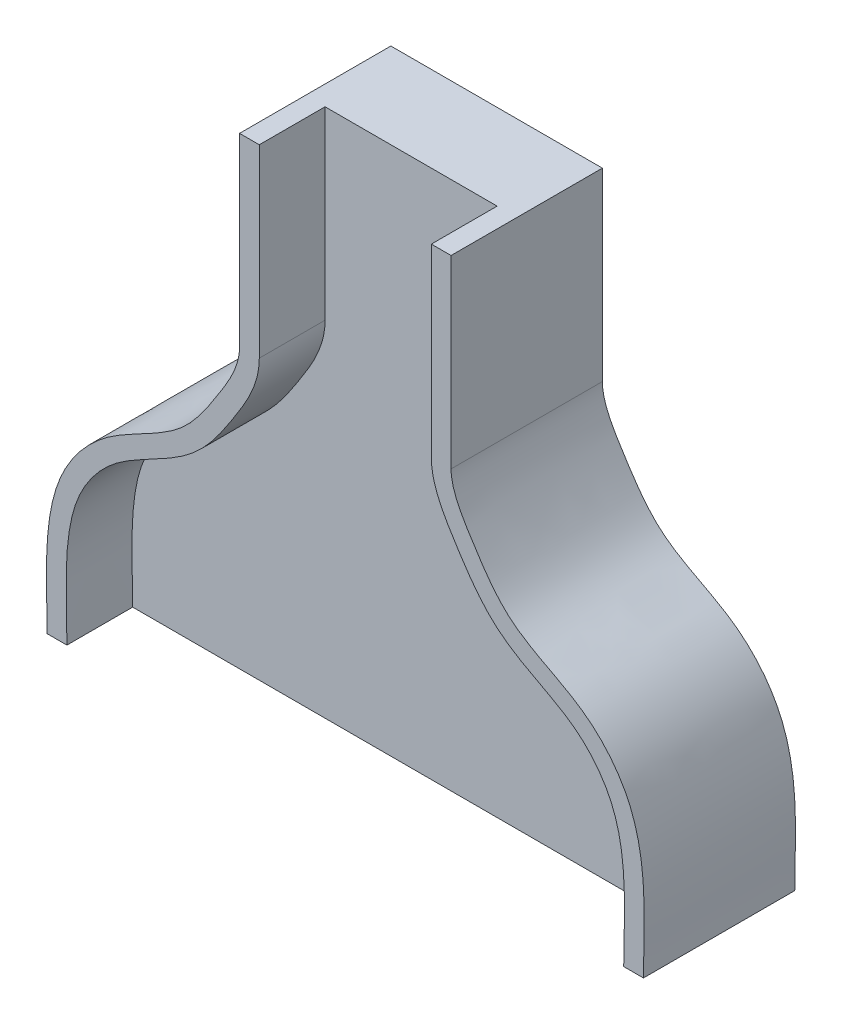
ISO-10303-21;
HEADER;
FILE_DESCRIPTION(('STEP AP214'),'2;1');
FILE_NAME('part.step','',(''),(''),'','','');
FILE_SCHEMA(('AUTOMOTIVE_DESIGN { 1 0 10303 214 1 1 1 1 }'));
ENDSEC;
DATA;
#1=APPLICATION_CONTEXT('core data for automotive mechanical design processes');
#2=APPLICATION_PROTOCOL_DEFINITION('international standard','automotive_design',2000,#1);
#3=PRODUCT_CONTEXT('',#1,'mechanical');
#4=PRODUCT('Part','Part','',(#3));
#5=PRODUCT_RELATED_PRODUCT_CATEGORY('part','',(#4));
#6=PRODUCT_DEFINITION_FORMATION('','',#4);
#7=PRODUCT_DEFINITION_CONTEXT('part definition',#1,'design');
#8=PRODUCT_DEFINITION('design','',#6,#7);
#9=PRODUCT_DEFINITION_SHAPE('','',#8);
#10=(LENGTH_UNIT() NAMED_UNIT(*) SI_UNIT(.MILLI.,.METRE.));
#11=(NAMED_UNIT(*) PLANE_ANGLE_UNIT() SI_UNIT($,.RADIAN.));
#12=(NAMED_UNIT(*) SI_UNIT($,.STERADIAN.) SOLID_ANGLE_UNIT());
#13=UNCERTAINTY_MEASURE_WITH_UNIT(LENGTH_MEASURE(1.E-05),#10,'distance_accuracy_value','');
#14=(GEOMETRIC_REPRESENTATION_CONTEXT(3) GLOBAL_UNCERTAINTY_ASSIGNED_CONTEXT((#13)) GLOBAL_UNIT_ASSIGNED_CONTEXT((#10,
#11,#12)) REPRESENTATION_CONTEXT('',''));
#15=CARTESIAN_POINT('',(0.,0.,0.));
#16=DIRECTION('',(0.,0.,1.));
#17=DIRECTION('',(1.,0.,0.));
#18=AXIS2_PLACEMENT_3D('',#15,#16,#17);
#19=CARTESIAN_POINT('',(11.3560564434234,41.916469453786,13.));
#20=DIRECTION('',(0.,0.,-1.));
#21=DIRECTION('',(-1.,0.,0.));
#22=AXIS2_PLACEMENT_3D('',#19,#20,#21);
#23=PLANE('',#22);
#24=CARTESIAN_POINT('',(90.7885163839061,12.2043310052196,13.));
#25=CARTESIAN_POINT('',(90.7907385917334,13.5108086506275,13.));
#26=CARTESIAN_POINT('',(90.8204245142585,14.831885643645,13.));
#27=CARTESIAN_POINT('',(90.8771412079609,17.4800295011893,13.));
#28=CARTESIAN_POINT('',(90.9042296775414,18.8070199288483,13.));
#29=CARTESIAN_POINT('',(90.9030050098147,22.7520053944305,13.));
#30=CARTESIAN_POINT('',(90.788620296591,25.3334691189714,13.));
#31=CARTESIAN_POINT('',(90.1826831121027,28.9299196411498,13.));
#32=CARTESIAN_POINT('',(89.9093545349235,30.0824944682274,13.));
#33=CARTESIAN_POINT('',(89.3665723681147,31.7251527920537,13.));
#34=CARTESIAN_POINT('',(89.163553765839,32.2584697870363,13.));
#35=CARTESIAN_POINT('',(88.7087210852857,33.2958353739081,13.));
#36=CARTESIAN_POINT('',(88.4546918523771,33.8041319641894,13.));
#37=CARTESIAN_POINT('',(87.0508202706975,36.2993070416371,13.));
#38=CARTESIAN_POINT('',(85.5062885483655,38.1234154188238,13.));
#39=CARTESIAN_POINT('',(83.247671587357,39.9470605741203,13.));
#40=CARTESIAN_POINT('',(82.7823128322237,40.2860911520853,13.));
#41=CARTESIAN_POINT('',(81.7894786593612,40.9473116263716,13.));
#42=CARTESIAN_POINT('',(81.266128474671,41.2673237394009,13.));
#43=CARTESIAN_POINT('',(79.6311234466667,42.213099327925,13.));
#44=CARTESIAN_POINT('',(78.4544330046763,42.8229465040545,13.));
#45=CARTESIAN_POINT('',(76.0304394313467,44.1268459438375,13.));
#46=CARTESIAN_POINT('',(74.7822545553732,44.8209092024868,13.));
#47=CARTESIAN_POINT('',(72.9447803945051,46.057426343286,13.));
#48=CARTESIAN_POINT('',(72.3382837330114,46.5026526237825,13.));
#49=CARTESIAN_POINT('',(71.4536306371995,47.2384524500872,13.));
#50=CARTESIAN_POINT('',(71.164266124772,47.4946310319936,13.));
#51=CARTESIAN_POINT('',(70.6082661553949,48.0163727924184,13.));
#52=CARTESIAN_POINT('',(70.3397852307367,48.2832777024401,13.));
#53=CARTESIAN_POINT('',(69.040196623681,49.6421285340913,13.));
#54=CARTESIAN_POINT('',(68.1376231701748,50.8047479777917,13.));
#55=CARTESIAN_POINT('',(66.8874129981532,52.5808069181246,13.));
#56=CARTESIAN_POINT('',(66.4879628009726,53.1786449976168,13.));
#57=CARTESIAN_POINT('',(65.9031388002056,54.0766430688057,13.));
#58=CARTESIAN_POINT('',(65.7106022401617,54.3761929180411,13.));
#59=CARTESIAN_POINT('',(65.3285644777152,54.9745690739093,13.));
#60=CARTESIAN_POINT('',(65.1396521306257,55.2716527533241,13.));
#61=CARTESIAN_POINT('',(64.5607729353148,56.1900948355357,13.));
#62=CARTESIAN_POINT('',(64.1656600187395,56.8299416846216,13.));
#63=CARTESIAN_POINT('',(63.4032998694341,58.1712744157069,13.));
#64=CARTESIAN_POINT('',(63.0357021179857,58.8728548764667,13.));
#65=CARTESIAN_POINT('',(62.3817508511164,60.3553340841867,13.));
#66=CARTESIAN_POINT('',(62.0948284710687,61.1370264597568,13.));
#67=CARTESIAN_POINT('',(61.6775549956611,62.7984043640918,13.));
#68=CARTESIAN_POINT('',(61.5480247573498,63.680139970537,13.));
#69=CARTESIAN_POINT('',(61.5480247573498,64.5992165462909,13.));
#70=B_SPLINE_CURVE_WITH_KNOTS('',3,(#24,#25,#26,#27,#28,#29,#30,#31,#32,#33,#34,#35,#36,#37,#38,
#39,#40,#41,#42,#43,#44,#45,#46,#47,#48,#49,#50,#51,#52,#53,#54,#55,#56,#57,#58,#59,#60,#61,#62,
#63,#64,#65,#66,#67,#68,#69),.UNSPECIFIED.,.F.,.F.,(4,2,2,2,2,2,2,2,2,2,2,2,2,2,2,2,2,2,2,2,2,2,
4),(0.,0.0625,0.125,0.25,0.3125,0.34375,0.375,0.5,0.531250000000001,0.562500000000001,
0.625000000000001,0.687500000000001,0.718750000000001,0.734375000000001,0.750000000000001,
0.8125,0.84375,0.859375,0.874999999999999,0.90625,0.9375,0.96875,1.),.UNSPECIFIED.);
#71=CARTESIAN_POINT('',(90.7885163839061,12.2043310052196,13.));
#72=VERTEX_POINT('',#71);
#73=CARTESIAN_POINT('',(61.5480247573498,64.599216546291,13.));
#74=VERTEX_POINT('',#73);
#75=EDGE_CURVE('E487',#72,#74,#70,.T.);
#76=ORIENTED_EDGE('',*,*,#75,.T.);
#77=DIRECTION('',(0.,1.,0.));
#78=VECTOR('',#77,1.);
#79=CARTESIAN_POINT('',(61.5480247573498,64.599216546291,13.));
#80=LINE('',#79,#78);
#81=CARTESIAN_POINT('',(61.5480247573498,92.6958024374448,13.));
#82=VERTEX_POINT('',#81);
#83=EDGE_CURVE('E310',#74,#82,#80,.T.);
#84=ORIENTED_EDGE('',*,*,#83,.T.);
#85=DIRECTION('',(-1.,0.,0.));
#86=VECTOR('',#85,1.);
#87=CARTESIAN_POINT('',(48.4700367288463,92.6958024374448,13.));
#88=LINE('',#87,#86);
#89=CARTESIAN_POINT('',(35.3920487003428,92.6958024374448,13.));
#90=VERTEX_POINT('',#89);
#91=EDGE_CURVE('E109',#82,#90,#88,.T.);
#92=ORIENTED_EDGE('',*,*,#91,.T.);
#93=DIRECTION('',(0.,1.,0.));
#94=VECTOR('',#93,1.);
#95=CARTESIAN_POINT('',(35.3920487003428,64.599216546291,13.));
#96=LINE('',#95,#94);
#97=CARTESIAN_POINT('',(35.3920487003428,64.599216546291,13.));
#98=VERTEX_POINT('',#97);
#99=EDGE_CURVE('E184',#98,#90,#96,.T.);
#100=ORIENTED_EDGE('',*,*,#99,.F.);
#101=CARTESIAN_POINT('',(6.15155707378647,12.2043310052196,13.));
#102=CARTESIAN_POINT('',(6.14933486595926,13.5108086506275,13.));
#103=CARTESIAN_POINT('',(6.11964894343409,14.831885643645,13.));
#104=CARTESIAN_POINT('',(6.06293224973176,17.4800295011893,13.));
#105=CARTESIAN_POINT('',(6.03584378015122,18.8070199288483,13.));
#106=CARTESIAN_POINT('',(6.0370684478779,22.7520053944305,13.));
#107=CARTESIAN_POINT('',(6.15145316110158,25.3334691189714,13.));
#108=CARTESIAN_POINT('',(6.75739034558997,28.9299196411498,13.));
#109=CARTESIAN_POINT('',(7.03071892276913,30.0824944682274,13.));
#110=CARTESIAN_POINT('',(7.57350108957787,31.7251527920537,13.));
#111=CARTESIAN_POINT('',(7.77651969185363,32.2584697870363,13.));
#112=CARTESIAN_POINT('',(8.23135237240688,33.2958353739081,13.));
#113=CARTESIAN_POINT('',(8.48538160531549,33.8041319641894,13.));
#114=CARTESIAN_POINT('',(9.8892531869951,36.2993070416371,13.));
#115=CARTESIAN_POINT('',(11.4337849093271,38.1234154188238,13.));
#116=CARTESIAN_POINT('',(13.6924018703357,39.9470605741203,13.));
#117=CARTESIAN_POINT('',(14.1577606254689,40.2860911520853,13.));
#118=CARTESIAN_POINT('',(15.1505947983314,40.9473116263716,13.));
#119=CARTESIAN_POINT('',(15.6739449830216,41.2673237394009,13.));
#120=CARTESIAN_POINT('',(17.3089500110259,42.213099327925,13.));
#121=CARTESIAN_POINT('',(18.4856404530163,42.8229465040545,13.));
#122=CARTESIAN_POINT('',(20.909634026346,44.1268459438375,13.));
#123=CARTESIAN_POINT('',(22.1578189023194,44.8209092024868,13.));
#124=CARTESIAN_POINT('',(23.9952930631875,46.057426343286,13.));
#125=CARTESIAN_POINT('',(24.6017897246812,46.5026526237825,13.));
#126=CARTESIAN_POINT('',(25.4864428204931,47.2384524500872,13.));
#127=CARTESIAN_POINT('',(25.7758073329206,47.4946310319936,13.));
#128=CARTESIAN_POINT('',(26.3318073022978,48.0163727924184,13.));
#129=CARTESIAN_POINT('',(26.6002882269559,48.2832777024401,13.));
#130=CARTESIAN_POINT('',(27.8998768340116,49.6421285340913,13.));
#131=CARTESIAN_POINT('',(28.8024502875178,50.8047479777917,13.));
#132=CARTESIAN_POINT('',(30.0526604595394,52.5808069181246,13.));
#133=CARTESIAN_POINT('',(30.45211065672,53.1786449976168,13.));
#134=CARTESIAN_POINT('',(31.0369346574871,54.0766430688057,13.));
#135=CARTESIAN_POINT('',(31.229471217531,54.3761929180411,13.));
#136=CARTESIAN_POINT('',(31.6115089799774,54.9745690739093,13.));
#137=CARTESIAN_POINT('',(31.8004213270669,55.2716527533241,13.));
#138=CARTESIAN_POINT('',(32.3793005223778,56.1900948355357,13.));
#139=CARTESIAN_POINT('',(32.7744134389531,56.8299416846216,13.));
#140=CARTESIAN_POINT('',(33.5367735882585,58.1712744157069,13.));
#141=CARTESIAN_POINT('',(33.904371339707,58.8728548764667,13.));
#142=CARTESIAN_POINT('',(34.5583226065762,60.3553340841867,13.));
#143=CARTESIAN_POINT('',(34.8452449866239,61.1370264597568,13.));
#144=CARTESIAN_POINT('',(35.2625184620316,62.7984043640918,13.));
#145=CARTESIAN_POINT('',(35.3920487003428,63.680139970537,13.));
#146=CARTESIAN_POINT('',(35.3920487003428,64.5992165462909,13.));
#147=B_SPLINE_CURVE_WITH_KNOTS('',3,(#101,#102,#103,#104,#105,#106,#107,#108,#109,#110,#111,
#112,#113,#114,#115,#116,#117,#118,#119,#120,#121,#122,#123,#124,#125,#126,#127,#128,#129,#130,
#131,#132,#133,#134,#135,#136,#137,#138,#139,#140,#141,#142,#143,#144,#145,#146),.UNSPECIFIED.,
.F.,.F.,(4,2,2,2,2,2,2,2,2,2,2,2,2,2,2,2,2,2,2,2,2,2,4),(0.,0.0625,0.125,0.25,0.3125,0.34375,
0.375,0.5,0.531250000000001,0.562500000000001,0.625000000000001,0.687500000000001,
0.718750000000001,0.734375000000001,0.750000000000001,0.8125,0.84375,0.859375,0.874999999999999,
0.90625,0.9375,0.96875,1.),.UNSPECIFIED.);
#148=CARTESIAN_POINT('',(6.15155707378647,12.2043310052196,13.));
#149=VERTEX_POINT('',#148);
#150=EDGE_CURVE('E190',#149,#98,#147,.T.);
#151=ORIENTED_EDGE('',*,*,#150,.F.);
#152=DIRECTION('',(-0.999998553446695,-0.00170091284797808,0.));
#153=VECTOR('',#152,1.);
#154=CARTESIAN_POINT('',(6.15155707378647,12.2043310052196,13.));
#155=LINE('',#154,#153);
#156=CARTESIAN_POINT('',(3.15156141344639,12.1992282666757,13.));
#157=VERTEX_POINT('',#156);
#158=EDGE_CURVE('E260',#149,#157,#155,.T.);
#159=ORIENTED_EDGE('',*,*,#158,.T.);
#160=DIRECTION('',(1.,0.,0.));
#161=VECTOR('',#160,1.);
#162=CARTESIAN_POINT('',(3.15156141344639,12.1992282666757,13.));
#163=LINE('',#162,#161);
#164=CARTESIAN_POINT('',(93.7885120442462,12.1992282666757,13.));
#165=VERTEX_POINT('',#164);
#166=EDGE_CURVE('E105',#157,#165,#163,.T.);
#167=ORIENTED_EDGE('',*,*,#166,.T.);
#168=DIRECTION('',(0.999998553446695,-0.00170091284797808,0.));
#169=VECTOR('',#168,1.);
#170=CARTESIAN_POINT('',(90.7885163839061,12.2043310052196,13.));
#171=LINE('',#170,#169);
#172=EDGE_CURVE('E323',#72,#165,#171,.T.);
#173=ORIENTED_EDGE('',*,*,#172,.F.);
#174=EDGE_LOOP('',(#76,#84,#92,#100,#151,#159,#167,#173));
#175=FACE_BOUND('',#174,.T.);
#176=ADVANCED_FACE('F39',(#175),#23,.F.);
#177=CARTESIAN_POINT('',(32.3920487003428,64.599216546291,13.));
#178=CARTESIAN_POINT('',(32.3920487003428,61.8804055889356,13.));
#179=CARTESIAN_POINT('',(28.9973289850857,56.3661889513694,13.));
#180=CARTESIAN_POINT('',(23.2677515981483,47.6702954668958,13.));
#181=CARTESIAN_POINT('',(12.1373219256361,43.9661241484139,13.));
#182=CARTESIAN_POINT('',(1.89268663702376,31.3878632979174,13.));
#183=CARTESIAN_POINT('',(3.13961117710121,19.2249962669152,13.));
#184=CARTESIAN_POINT('',(3.15156141344639,12.1992282666757,13.));
#185=B_SPLINE_CURVE_WITH_KNOTS('',3,(#177,#178,#179,#180,#181,#182,#183,#184),.UNSPECIFIED.,.F.,
.F.,(4,1,1,1,1,4),(0.,0.133259385833824,0.277219628087343,0.485924000963981,0.652613178111084,
1.),.UNSPECIFIED.);
#186=DIRECTION('',(0.,0.,-1.));
#187=VECTOR('',#186,1.);
#188=SURFACE_OF_LINEAR_EXTRUSION('',#185,#187);
#189=CARTESIAN_POINT('',(32.3920487003428,64.599216546291,0.));
#190=CARTESIAN_POINT('',(32.3920487003428,61.8804055889356,0.));
#191=CARTESIAN_POINT('',(28.9973289850857,56.3661889513694,0.));
#192=CARTESIAN_POINT('',(23.2677515981483,47.6702954668958,0.));
#193=CARTESIAN_POINT('',(12.1373219256361,43.9661241484139,0.));
#194=CARTESIAN_POINT('',(1.89268663702376,31.3878632979174,0.));
#195=CARTESIAN_POINT('',(3.13961117710121,19.2249962669152,0.));
#196=CARTESIAN_POINT('',(3.15156141344639,12.1992282666757,0.));
#197=B_SPLINE_CURVE_WITH_KNOTS('',3,(#189,#190,#191,#192,#193,#194,#195,#196),.UNSPECIFIED.,.F.,
.F.,(4,1,1,1,1,4),(0.,0.133259385833824,0.277219628087343,0.485924000963981,0.652613178111084,
1.),.UNSPECIFIED.);
#198=CARTESIAN_POINT('',(32.3920487003428,64.599216546291,0.));
#199=VERTEX_POINT('',#198);
#200=CARTESIAN_POINT('',(3.15156141344639,12.1992282666757,0.));
#201=VERTEX_POINT('',#200);
#202=EDGE_CURVE('E103',#199,#201,#197,.T.);
#203=ORIENTED_EDGE('',*,*,#202,.T.);
#204=DIRECTION('',(0.,0.,-1.));
#205=VECTOR('',#204,1.);
#206=CARTESIAN_POINT('',(3.15156141344639,12.1992282666757,13.));
#207=LINE('',#206,#205);
#208=EDGE_CURVE('E11',#157,#201,#207,.T.);
#209=ORIENTED_EDGE('',*,*,#208,.F.);
#210=DIRECTION('',(0.,0.,-1.));
#211=VECTOR('',#210,1.);
#212=CARTESIAN_POINT('',(3.15156141344639,12.1992282666757,23.));
#213=LINE('',#212,#211);
#214=CARTESIAN_POINT('',(3.15156141344639,12.1992282666757,23.));
#215=VERTEX_POINT('',#214);
#216=EDGE_CURVE('E57',#215,#157,#213,.T.);
#217=ORIENTED_EDGE('',*,*,#216,.F.);
#218=CARTESIAN_POINT('',(3.15156141344639,12.1992282666757,23.));
#219=CARTESIAN_POINT('',(3.13961117710121,19.2249962669152,23.));
#220=CARTESIAN_POINT('',(1.89268663702376,31.3878632979174,23.));
#221=CARTESIAN_POINT('',(12.1373219256361,43.9661241484139,23.));
#222=CARTESIAN_POINT('',(23.2677515981483,47.6702954668958,23.));
#223=CARTESIAN_POINT('',(28.9973289850857,56.3661889513694,23.));
#224=CARTESIAN_POINT('',(32.3920487003428,61.8804055889356,23.));
#225=CARTESIAN_POINT('',(32.3920487003428,64.599216546291,23.));
#226=B_SPLINE_CURVE_WITH_KNOTS('',3,(#218,#219,#220,#221,#222,#223,#224,#225),.UNSPECIFIED.,.F.,
.F.,(4,1,1,1,1,4),(0.,0.347386821888916,0.514075999036019,0.722780371912657,0.866740614166176,
1.),.UNSPECIFIED.);
#227=CARTESIAN_POINT('',(32.3920487003428,64.599216546291,23.));
#228=VERTEX_POINT('',#227);
#229=EDGE_CURVE('E195',#215,#228,#226,.T.);
#230=ORIENTED_EDGE('',*,*,#229,.T.);
#231=DIRECTION('',(0.,0.,-1.));
#232=VECTOR('',#231,1.);
#233=CARTESIAN_POINT('',(32.3920487003428,64.599216546291,13.));
#234=LINE('',#233,#232);
#235=EDGE_CURVE('E99',#228,#199,#234,.T.);
#236=ORIENTED_EDGE('',*,*,#235,.T.);
#237=EDGE_LOOP('',(#203,#209,#217,#230,#236));
#238=FACE_BOUND('',#237,.T.);
#239=ADVANCED_FACE('F41',(#238),#188,.F.);
#240=CARTESIAN_POINT('',(3.15156141344639,12.1992282666757,13.));
#241=DIRECTION('',(0.,1.,0.));
#242=DIRECTION('',(-1.,0.,0.));
#243=AXIS2_PLACEMENT_3D('',#240,#241,#242);
#244=PLANE('',#243);
#245=DIRECTION('',(1.,0.,0.));
#246=VECTOR('',#245,1.);
#247=CARTESIAN_POINT('',(3.15156141344639,12.1992282666757,0.));
#248=LINE('',#247,#246);
#249=CARTESIAN_POINT('',(93.7885120442462,12.1992282666757,0.));
#250=VERTEX_POINT('',#249);
#251=EDGE_CURVE('E89',#201,#250,#248,.T.);
#252=ORIENTED_EDGE('',*,*,#251,.T.);
#253=DIRECTION('',(0.,0.,-1.));
#254=VECTOR('',#253,1.);
#255=CARTESIAN_POINT('',(93.7885120442462,12.1992282666757,13.));
#256=LINE('',#255,#254);
#257=EDGE_CURVE('E142',#165,#250,#256,.T.);
#258=ORIENTED_EDGE('',*,*,#257,.F.);
#259=ORIENTED_EDGE('',*,*,#166,.F.);
#260=ORIENTED_EDGE('',*,*,#208,.T.);
#261=EDGE_LOOP('',(#252,#258,#259,#260));
#262=FACE_BOUND('',#261,.T.);
#263=ADVANCED_FACE('F139',(#262),#244,.F.);
#264=CARTESIAN_POINT('',(48.4700367288463,92.6958024374448,13.));
#265=DIRECTION('',(0.,-1.,0.));
#266=DIRECTION('',(0.,0.,-1.));
#267=AXIS2_PLACEMENT_3D('',#264,#265,#266);
#268=PLANE('',#267);
#269=DIRECTION('',(-1.,0.,0.));
#270=VECTOR('',#269,1.);
#271=CARTESIAN_POINT('',(48.4700367288463,92.6958024374448,0.));
#272=LINE('',#271,#270);
#273=CARTESIAN_POINT('',(64.5480247573498,92.6958024374448,0.));
#274=VERTEX_POINT('',#273);
#275=CARTESIAN_POINT('',(32.3920487003428,92.6958024374448,0.));
#276=VERTEX_POINT('',#275);
#277=EDGE_CURVE('E73',#274,#276,#272,.T.);
#278=ORIENTED_EDGE('',*,*,#277,.T.);
#279=DIRECTION('',(0.,0.,-1.));
#280=VECTOR('',#279,1.);
#281=CARTESIAN_POINT('',(32.3920487003428,92.6958024374448,13.));
#282=LINE('',#281,#280);
#283=CARTESIAN_POINT('',(32.3920487003428,92.6958024374448,23.));
#284=VERTEX_POINT('',#283);
#285=EDGE_CURVE('E50',#284,#276,#282,.T.);
#286=ORIENTED_EDGE('',*,*,#285,.F.);
#287=DIRECTION('',(1.,0.,0.));
#288=VECTOR('',#287,1.);
#289=CARTESIAN_POINT('',(32.3920487003428,92.6958024374448,23.));
#290=LINE('',#289,#288);
#291=CARTESIAN_POINT('',(35.3920487003428,92.6958024374448,23.));
#292=VERTEX_POINT('',#291);
#293=EDGE_CURVE('E189',#284,#292,#290,.T.);
#294=ORIENTED_EDGE('',*,*,#293,.T.);
#295=DIRECTION('',(0.,0.,-1.));
#296=VECTOR('',#295,1.);
#297=CARTESIAN_POINT('',(35.3920487003428,92.6958024374448,23.));
#298=LINE('',#297,#296);
#299=EDGE_CURVE('E129',#292,#90,#298,.T.);
#300=ORIENTED_EDGE('',*,*,#299,.T.);
#301=ORIENTED_EDGE('',*,*,#91,.F.);
#302=DIRECTION('',(0.,0.,-1.));
#303=VECTOR('',#302,1.);
#304=CARTESIAN_POINT('',(61.5480247573498,92.6958024374448,23.));
#305=LINE('',#304,#303);
#306=CARTESIAN_POINT('',(61.5480247573498,92.6958024374448,23.));
#307=VERTEX_POINT('',#306);
#308=EDGE_CURVE('E495',#307,#82,#305,.T.);
#309=ORIENTED_EDGE('',*,*,#308,.F.);
#310=DIRECTION('',(-1.,0.,0.));
#311=VECTOR('',#310,1.);
#312=CARTESIAN_POINT('',(64.5480247573498,92.6958024374448,23.));
#313=LINE('',#312,#311);
#314=CARTESIAN_POINT('',(64.5480247573498,92.6958024374448,23.));
#315=VERTEX_POINT('',#314);
#316=EDGE_CURVE('E320',#315,#307,#313,.T.);
#317=ORIENTED_EDGE('',*,*,#316,.F.);
#318=DIRECTION('',(0.,0.,-1.));
#319=VECTOR('',#318,1.);
#320=CARTESIAN_POINT('',(64.5480247573498,92.6958024374448,13.));
#321=LINE('',#320,#319);
#322=EDGE_CURVE('E82',#315,#274,#321,.T.);
#323=ORIENTED_EDGE('',*,*,#322,.T.);
#324=EDGE_LOOP('',(#278,#286,#294,#300,#301,#309,#317,#323));
#325=FACE_BOUND('',#324,.T.);
#326=ADVANCED_FACE('F75',(#325),#268,.F.);
#327=CARTESIAN_POINT('',(32.3920487003428,64.599216546291,13.));
#328=DIRECTION('',(1.,0.,0.));
#329=DIRECTION('',(0.,0.,-1.));
#330=AXIS2_PLACEMENT_3D('',#327,#328,#329);
#331=PLANE('',#330);
#332=DIRECTION('',(0.,-1.,0.));
#333=VECTOR('',#332,1.);
#334=CARTESIAN_POINT('',(32.3920487003428,64.599216546291,0.));
#335=LINE('',#334,#333);
#336=EDGE_CURVE('E88',#276,#199,#335,.T.);
#337=ORIENTED_EDGE('',*,*,#336,.T.);
#338=ORIENTED_EDGE('',*,*,#235,.F.);
#339=DIRECTION('',(0.,1.,0.));
#340=VECTOR('',#339,1.);
#341=CARTESIAN_POINT('',(32.3920487003428,64.599216546291,23.));
#342=LINE('',#341,#340);
#343=EDGE_CURVE('E97',#228,#284,#342,.T.);
#344=ORIENTED_EDGE('',*,*,#343,.T.);
#345=ORIENTED_EDGE('',*,*,#285,.T.);
#346=EDGE_LOOP('',(#337,#338,#344,#345));
#347=FACE_BOUND('',#346,.T.);
#348=ADVANCED_FACE('F93',(#347),#331,.F.);
#349=CARTESIAN_POINT('',(11.3560564434234,41.916469453786,0.));
#350=DIRECTION('',(0.,0.,-1.));
#351=DIRECTION('',(-1.,0.,0.));
#352=AXIS2_PLACEMENT_3D('',#349,#350,#351);
#353=PLANE('',#352);
#354=ORIENTED_EDGE('',*,*,#202,.F.);
#355=ORIENTED_EDGE('',*,*,#336,.F.);
#356=ORIENTED_EDGE('',*,*,#277,.F.);
#357=DIRECTION('',(0.,-1.,0.));
#358=VECTOR('',#357,1.);
#359=CARTESIAN_POINT('',(64.5480247573498,64.599216546291,0.));
#360=LINE('',#359,#358);
#361=CARTESIAN_POINT('',(64.5480247573498,64.599216546291,0.));
#362=VERTEX_POINT('',#361);
#363=EDGE_CURVE('E157',#274,#362,#360,.T.);
#364=ORIENTED_EDGE('',*,*,#363,.T.);
#365=CARTESIAN_POINT('',(64.5480247573498,64.599216546291,0.));
#366=CARTESIAN_POINT('',(64.5480247573498,61.8804055889356,0.));
#367=CARTESIAN_POINT('',(67.9427444726069,56.3661889513694,0.));
#368=CARTESIAN_POINT('',(73.6723218595443,47.6702954668958,0.));
#369=CARTESIAN_POINT('',(84.8027515320565,43.9661241484139,0.));
#370=CARTESIAN_POINT('',(95.0473868206689,31.3878632979174,0.));
#371=CARTESIAN_POINT('',(93.8004622805914,19.2249962669152,0.));
#372=CARTESIAN_POINT('',(93.7885120442462,12.1992282666757,0.));
#373=B_SPLINE_CURVE_WITH_KNOTS('',3,(#365,#366,#367,#368,#369,#370,#371,#372),.UNSPECIFIED.,.F.,
.F.,(4,1,1,1,1,4),(0.,0.133259385833824,0.277219628087343,0.485924000963981,0.652613178111084,
1.),.UNSPECIFIED.);
#374=EDGE_CURVE('E152',#362,#250,#373,.T.);
#375=ORIENTED_EDGE('',*,*,#374,.T.);
#376=ORIENTED_EDGE('',*,*,#251,.F.);
#377=EDGE_LOOP('',(#354,#355,#356,#364,#375,#376));
#378=FACE_BOUND('',#377,.T.);
#379=ADVANCED_FACE('F101',(#378),#353,.T.);
#380=CARTESIAN_POINT('',(35.3920487003428,64.599216546291,23.));
#381=DIRECTION('',(-1.,0.,0.));
#382=DIRECTION('',(0.,0.,1.));
#383=AXIS2_PLACEMENT_3D('',#380,#381,#382);
#384=PLANE('',#383);
#385=ORIENTED_EDGE('',*,*,#99,.T.);
#386=ORIENTED_EDGE('',*,*,#299,.F.);
#387=DIRECTION('',(0.,1.,0.));
#388=VECTOR('',#387,1.);
#389=CARTESIAN_POINT('',(35.3920487003428,64.599216546291,23.));
#390=LINE('',#389,#388);
#391=CARTESIAN_POINT('',(35.3920487003428,64.599216546291,23.));
#392=VERTEX_POINT('',#391);
#393=EDGE_CURVE('E185',#392,#292,#390,.T.);
#394=ORIENTED_EDGE('',*,*,#393,.F.);
#395=DIRECTION('',(0.,0.,-1.));
#396=VECTOR('',#395,1.);
#397=CARTESIAN_POINT('',(35.3920487003428,64.599216546291,23.));
#398=LINE('',#397,#396);
#399=EDGE_CURVE('E213',#392,#98,#398,.T.);
#400=ORIENTED_EDGE('',*,*,#399,.T.);
#401=EDGE_LOOP('',(#385,#386,#394,#400));
#402=FACE_BOUND('',#401,.T.);
#403=ADVANCED_FACE('F229',(#402),#384,.F.);
#404=CARTESIAN_POINT('',(6.15155707378647,12.2043310052196,23.));
#405=DIRECTION('',(0.00170091284797808,-0.999998553446696,0.));
#406=DIRECTION('',(0.999998553446696,0.00170091284797808,0.));
#407=AXIS2_PLACEMENT_3D('',#404,#405,#406);
#408=PLANE('',#407);
#409=ORIENTED_EDGE('',*,*,#158,.F.);
#410=DIRECTION('',(0.,0.,-1.));
#411=VECTOR('',#410,1.);
#412=CARTESIAN_POINT('',(6.15155707378647,12.2043310052196,23.));
#413=LINE('',#412,#411);
#414=CARTESIAN_POINT('',(6.15155707378647,12.2043310052196,23.));
#415=VERTEX_POINT('',#414);
#416=EDGE_CURVE('E252',#415,#149,#413,.T.);
#417=ORIENTED_EDGE('',*,*,#416,.F.);
#418=DIRECTION('',(-0.999998553446695,-0.00170091284797808,0.));
#419=VECTOR('',#418,1.);
#420=CARTESIAN_POINT('',(6.15155707378647,12.2043310052196,23.));
#421=LINE('',#420,#419);
#422=EDGE_CURVE('E200',#415,#215,#421,.T.);
#423=ORIENTED_EDGE('',*,*,#422,.T.);
#424=ORIENTED_EDGE('',*,*,#216,.T.);
#425=EDGE_LOOP('',(#409,#417,#423,#424));
#426=FACE_BOUND('',#425,.T.);
#427=ADVANCED_FACE('F224',(#426),#408,.T.);
#428=CARTESIAN_POINT('',(6.15155707378647,12.2043310052196,23.));
#429=CARTESIAN_POINT('',(6.14933486595926,13.5108086506275,23.));
#430=CARTESIAN_POINT('',(6.11964894343409,14.831885643645,23.));
#431=CARTESIAN_POINT('',(6.06293224973176,17.4800295011893,23.));
#432=CARTESIAN_POINT('',(6.03584378015122,18.8070199288483,23.));
#433=CARTESIAN_POINT('',(6.0370684478779,22.7520053944305,23.));
#434=CARTESIAN_POINT('',(6.15145316110158,25.3334691189714,23.));
#435=CARTESIAN_POINT('',(6.75739034558997,28.9299196411498,23.));
#436=CARTESIAN_POINT('',(7.03071892276913,30.0824944682274,23.));
#437=CARTESIAN_POINT('',(7.57350108957787,31.7251527920537,23.));
#438=CARTESIAN_POINT('',(7.77651969185363,32.2584697870363,23.));
#439=CARTESIAN_POINT('',(8.23135237240688,33.2958353739081,23.));
#440=CARTESIAN_POINT('',(8.48538160531549,33.8041319641894,23.));
#441=CARTESIAN_POINT('',(9.8892531869951,36.2993070416371,23.));
#442=CARTESIAN_POINT('',(11.4337849093271,38.1234154188238,23.));
#443=CARTESIAN_POINT('',(13.6924018703357,39.9470605741203,23.));
#444=CARTESIAN_POINT('',(14.1577606254689,40.2860911520853,23.));
#445=CARTESIAN_POINT('',(15.1505947983314,40.9473116263716,23.));
#446=CARTESIAN_POINT('',(15.6739449830216,41.2673237394009,23.));
#447=CARTESIAN_POINT('',(17.3089500110259,42.213099327925,23.));
#448=CARTESIAN_POINT('',(18.4856404530163,42.8229465040545,23.));
#449=CARTESIAN_POINT('',(20.909634026346,44.1268459438375,23.));
#450=CARTESIAN_POINT('',(22.1578189023194,44.8209092024868,23.));
#451=CARTESIAN_POINT('',(23.9952930631875,46.057426343286,23.));
#452=CARTESIAN_POINT('',(24.6017897246812,46.5026526237825,23.));
#453=CARTESIAN_POINT('',(25.4864428204931,47.2384524500872,23.));
#454=CARTESIAN_POINT('',(25.7758073329206,47.4946310319936,23.));
#455=CARTESIAN_POINT('',(26.3318073022978,48.0163727924184,23.));
#456=CARTESIAN_POINT('',(26.6002882269559,48.2832777024401,23.));
#457=CARTESIAN_POINT('',(27.8998768340116,49.6421285340913,23.));
#458=CARTESIAN_POINT('',(28.8024502875178,50.8047479777917,23.));
#459=CARTESIAN_POINT('',(30.0526604595394,52.5808069181246,23.));
#460=CARTESIAN_POINT('',(30.45211065672,53.1786449976168,23.));
#461=CARTESIAN_POINT('',(31.0369346574871,54.0766430688057,23.));
#462=CARTESIAN_POINT('',(31.229471217531,54.3761929180411,23.));
#463=CARTESIAN_POINT('',(31.6115089799774,54.9745690739093,23.));
#464=CARTESIAN_POINT('',(31.8004213270669,55.2716527533241,23.));
#465=CARTESIAN_POINT('',(32.3793005223778,56.1900948355357,23.));
#466=CARTESIAN_POINT('',(32.7744134389531,56.8299416846216,23.));
#467=CARTESIAN_POINT('',(33.5367735882585,58.1712744157069,23.));
#468=CARTESIAN_POINT('',(33.904371339707,58.8728548764667,23.));
#469=CARTESIAN_POINT('',(34.5583226065762,60.3553340841867,23.));
#470=CARTESIAN_POINT('',(34.8452449866239,61.1370264597568,23.));
#471=CARTESIAN_POINT('',(35.2625184620316,62.7984043640918,23.));
#472=CARTESIAN_POINT('',(35.3920487003428,63.680139970537,23.));
#473=CARTESIAN_POINT('',(35.3920487003428,64.5992165462909,23.));
#474=B_SPLINE_CURVE_WITH_KNOTS('',3,(#428,#429,#430,#431,#432,#433,#434,#435,#436,#437,#438,
#439,#440,#441,#442,#443,#444,#445,#446,#447,#448,#449,#450,#451,#452,#453,#454,#455,#456,#457,
#458,#459,#460,#461,#462,#463,#464,#465,#466,#467,#468,#469,#470,#471,#472,#473),.UNSPECIFIED.,
.F.,.F.,(4,2,2,2,2,2,2,2,2,2,2,2,2,2,2,2,2,2,2,2,2,2,4),(0.,0.0625,0.125,0.25,0.3125,0.34375,
0.375,0.5,0.531250000000001,0.562500000000001,0.625000000000001,0.687500000000001,
0.718750000000001,0.734375000000001,0.750000000000001,0.8125,0.84375,0.859375,0.874999999999999,
0.90625,0.9375,0.96875,1.),.UNSPECIFIED.);
#475=DIRECTION('',(0.,0.,-1.));
#476=VECTOR('',#475,1.);
#477=SURFACE_OF_LINEAR_EXTRUSION('',#474,#476);
#478=ORIENTED_EDGE('',*,*,#150,.T.);
#479=ORIENTED_EDGE('',*,*,#399,.F.);
#480=EDGE_CURVE('E206',#415,#392,#474,.T.);
#481=ORIENTED_EDGE('',*,*,#480,.F.);
#482=ORIENTED_EDGE('',*,*,#416,.T.);
#483=EDGE_LOOP('',(#478,#479,#481,#482));
#484=FACE_BOUND('',#483,.T.);
#485=ADVANCED_FACE('F219',(#484),#477,.F.);
#486=CARTESIAN_POINT('',(11.3560564434234,41.916469453786,23.));
#487=DIRECTION('',(0.,0.,-1.));
#488=DIRECTION('',(-1.,0.,0.));
#489=AXIS2_PLACEMENT_3D('',#486,#487,#488);
#490=PLANE('',#489);
#491=ORIENTED_EDGE('',*,*,#393,.T.);
#492=ORIENTED_EDGE('',*,*,#293,.F.);
#493=ORIENTED_EDGE('',*,*,#343,.F.);
#494=ORIENTED_EDGE('',*,*,#229,.F.);
#495=ORIENTED_EDGE('',*,*,#422,.F.);
#496=ORIENTED_EDGE('',*,*,#480,.T.);
#497=EDGE_LOOP('',(#491,#492,#493,#494,#495,#496));
#498=FACE_BOUND('',#497,.T.);
#499=ADVANCED_FACE('F223',(#498),#490,.F.);
#500=CARTESIAN_POINT('',(64.5480247573498,64.599216546291,13.));
#501=CARTESIAN_POINT('',(64.5480247573498,61.8804055889356,13.));
#502=CARTESIAN_POINT('',(67.9427444726069,56.3661889513694,13.));
#503=CARTESIAN_POINT('',(73.6723218595443,47.6702954668958,13.));
#504=CARTESIAN_POINT('',(84.8027515320565,43.9661241484139,13.));
#505=CARTESIAN_POINT('',(95.0473868206689,31.3878632979174,13.));
#506=CARTESIAN_POINT('',(93.8004622805914,19.2249962669152,13.));
#507=CARTESIAN_POINT('',(93.7885120442462,12.1992282666757,13.));
#508=B_SPLINE_CURVE_WITH_KNOTS('',3,(#500,#501,#502,#503,#504,#505,#506,#507),.UNSPECIFIED.,.F.,
.F.,(4,1,1,1,1,4),(0.,0.133259385833824,0.277219628087343,0.485924000963981,0.652613178111084,
1.),.UNSPECIFIED.);
#509=DIRECTION('',(0.,0.,-1.));
#510=VECTOR('',#509,1.);
#511=SURFACE_OF_LINEAR_EXTRUSION('',#508,#510);
#512=ORIENTED_EDGE('',*,*,#374,.F.);
#513=DIRECTION('',(0.,0.,-1.));
#514=VECTOR('',#513,1.);
#515=CARTESIAN_POINT('',(64.5480247573498,64.599216546291,13.));
#516=LINE('',#515,#514);
#517=CARTESIAN_POINT('',(64.5480247573498,64.599216546291,23.));
#518=VERTEX_POINT('',#517);
#519=EDGE_CURVE('E180',#518,#362,#516,.T.);
#520=ORIENTED_EDGE('',*,*,#519,.F.);
#521=CARTESIAN_POINT('',(93.7885120442462,12.1992282666757,23.));
#522=CARTESIAN_POINT('',(93.8004622805914,19.2249962669152,23.));
#523=CARTESIAN_POINT('',(95.0473868206689,31.3878632979174,23.));
#524=CARTESIAN_POINT('',(84.8027515320565,43.9661241484139,23.));
#525=CARTESIAN_POINT('',(73.6723218595443,47.6702954668958,23.));
#526=CARTESIAN_POINT('',(67.9427444726069,56.3661889513694,23.));
#527=CARTESIAN_POINT('',(64.5480247573498,61.8804055889356,23.));
#528=CARTESIAN_POINT('',(64.5480247573498,64.599216546291,23.));
#529=B_SPLINE_CURVE_WITH_KNOTS('',3,(#521,#522,#523,#524,#525,#526,#527,#528),.UNSPECIFIED.,.F.,
.F.,(4,1,1,1,1,4),(0.,0.347386821888916,0.514075999036019,0.722780371912657,0.866740614166176,
1.),.UNSPECIFIED.);
#530=CARTESIAN_POINT('',(93.7885120442462,12.1992282666757,23.));
#531=VERTEX_POINT('',#530);
#532=EDGE_CURVE('E331',#531,#518,#529,.T.);
#533=ORIENTED_EDGE('',*,*,#532,.F.);
#534=DIRECTION('',(0.,0.,-1.));
#535=VECTOR('',#534,1.);
#536=CARTESIAN_POINT('',(93.7885120442462,12.1992282666757,23.));
#537=LINE('',#536,#535);
#538=EDGE_CURVE('E155',#531,#165,#537,.T.);
#539=ORIENTED_EDGE('',*,*,#538,.T.);
#540=ORIENTED_EDGE('',*,*,#257,.T.);
#541=EDGE_LOOP('',(#512,#520,#533,#539,#540));
#542=FACE_BOUND('',#541,.T.);
#543=ADVANCED_FACE('F149',(#542),#511,.T.);
#544=CARTESIAN_POINT('',(64.5480247573498,64.599216546291,13.));
#545=DIRECTION('',(1.,0.,0.));
#546=DIRECTION('',(0.,0.,-1.));
#547=AXIS2_PLACEMENT_3D('',#544,#545,#546);
#548=PLANE('',#547);
#549=ORIENTED_EDGE('',*,*,#363,.F.);
#550=ORIENTED_EDGE('',*,*,#322,.F.);
#551=DIRECTION('',(0.,1.,0.));
#552=VECTOR('',#551,1.);
#553=CARTESIAN_POINT('',(64.5480247573498,64.599216546291,23.));
#554=LINE('',#553,#552);
#555=EDGE_CURVE('E503',#518,#315,#554,.T.);
#556=ORIENTED_EDGE('',*,*,#555,.F.);
#557=ORIENTED_EDGE('',*,*,#519,.T.);
#558=EDGE_LOOP('',(#549,#550,#556,#557));
#559=FACE_BOUND('',#558,.T.);
#560=ADVANCED_FACE('F348',(#559),#548,.T.);
#561=CARTESIAN_POINT('',(61.5480247573498,64.599216546291,23.));
#562=DIRECTION('',(-1.,0.,0.));
#563=DIRECTION('',(0.,0.,1.));
#564=AXIS2_PLACEMENT_3D('',#561,#562,#563);
#565=PLANE('',#564);
#566=ORIENTED_EDGE('',*,*,#83,.F.);
#567=DIRECTION('',(0.,0.,-1.));
#568=VECTOR('',#567,1.);
#569=CARTESIAN_POINT('',(61.5480247573498,64.599216546291,23.));
#570=LINE('',#569,#568);
#571=CARTESIAN_POINT('',(61.5480247573498,64.599216546291,23.));
#572=VERTEX_POINT('',#571);
#573=EDGE_CURVE('E160',#572,#74,#570,.T.);
#574=ORIENTED_EDGE('',*,*,#573,.F.);
#575=DIRECTION('',(0.,1.,0.));
#576=VECTOR('',#575,1.);
#577=CARTESIAN_POINT('',(61.5480247573498,64.599216546291,23.));
#578=LINE('',#577,#576);
#579=EDGE_CURVE('E309',#572,#307,#578,.T.);
#580=ORIENTED_EDGE('',*,*,#579,.T.);
#581=ORIENTED_EDGE('',*,*,#308,.T.);
#582=EDGE_LOOP('',(#566,#574,#580,#581));
#583=FACE_BOUND('',#582,.T.);
#584=ADVANCED_FACE('F308',(#583),#565,.T.);
#585=CARTESIAN_POINT('',(90.7885163839061,12.2043310052196,23.));
#586=CARTESIAN_POINT('',(90.7907385917334,13.5108086506275,23.));
#587=CARTESIAN_POINT('',(90.8204245142585,14.831885643645,23.));
#588=CARTESIAN_POINT('',(90.8771412079609,17.4800295011893,23.));
#589=CARTESIAN_POINT('',(90.9042296775414,18.8070199288483,23.));
#590=CARTESIAN_POINT('',(90.9030050098147,22.7520053944305,23.));
#591=CARTESIAN_POINT('',(90.788620296591,25.3334691189714,23.));
#592=CARTESIAN_POINT('',(90.1826831121027,28.9299196411498,23.));
#593=CARTESIAN_POINT('',(89.9093545349235,30.0824944682274,23.));
#594=CARTESIAN_POINT('',(89.3665723681147,31.7251527920537,23.));
#595=CARTESIAN_POINT('',(89.163553765839,32.2584697870363,23.));
#596=CARTESIAN_POINT('',(88.7087210852857,33.2958353739081,23.));
#597=CARTESIAN_POINT('',(88.4546918523771,33.8041319641894,23.));
#598=CARTESIAN_POINT('',(87.0508202706975,36.2993070416371,23.));
#599=CARTESIAN_POINT('',(85.5062885483655,38.1234154188238,23.));
#600=CARTESIAN_POINT('',(83.247671587357,39.9470605741203,23.));
#601=CARTESIAN_POINT('',(82.7823128322237,40.2860911520853,23.));
#602=CARTESIAN_POINT('',(81.7894786593612,40.9473116263716,23.));
#603=CARTESIAN_POINT('',(81.266128474671,41.2673237394009,23.));
#604=CARTESIAN_POINT('',(79.6311234466667,42.213099327925,23.));
#605=CARTESIAN_POINT('',(78.4544330046763,42.8229465040545,23.));
#606=CARTESIAN_POINT('',(76.0304394313467,44.1268459438375,23.));
#607=CARTESIAN_POINT('',(74.7822545553732,44.8209092024868,23.));
#608=CARTESIAN_POINT('',(72.9447803945051,46.057426343286,23.));
#609=CARTESIAN_POINT('',(72.3382837330114,46.5026526237825,23.));
#610=CARTESIAN_POINT('',(71.4536306371995,47.2384524500872,23.));
#611=CARTESIAN_POINT('',(71.164266124772,47.4946310319936,23.));
#612=CARTESIAN_POINT('',(70.6082661553949,48.0163727924184,23.));
#613=CARTESIAN_POINT('',(70.3397852307367,48.2832777024401,23.));
#614=CARTESIAN_POINT('',(69.040196623681,49.6421285340913,23.));
#615=CARTESIAN_POINT('',(68.1376231701748,50.8047479777917,23.));
#616=CARTESIAN_POINT('',(66.8874129981532,52.5808069181246,23.));
#617=CARTESIAN_POINT('',(66.4879628009726,53.1786449976168,23.));
#618=CARTESIAN_POINT('',(65.9031388002056,54.0766430688057,23.));
#619=CARTESIAN_POINT('',(65.7106022401617,54.3761929180411,23.));
#620=CARTESIAN_POINT('',(65.3285644777152,54.9745690739093,23.));
#621=CARTESIAN_POINT('',(65.1396521306257,55.2716527533241,23.));
#622=CARTESIAN_POINT('',(64.5607729353148,56.1900948355357,23.));
#623=CARTESIAN_POINT('',(64.1656600187395,56.8299416846216,23.));
#624=CARTESIAN_POINT('',(63.4032998694341,58.1712744157069,23.));
#625=CARTESIAN_POINT('',(63.0357021179857,58.8728548764667,23.));
#626=CARTESIAN_POINT('',(62.3817508511164,60.3553340841867,23.));
#627=CARTESIAN_POINT('',(62.0948284710687,61.1370264597568,23.));
#628=CARTESIAN_POINT('',(61.6775549956611,62.7984043640918,23.));
#629=CARTESIAN_POINT('',(61.5480247573498,63.680139970537,23.));
#630=CARTESIAN_POINT('',(61.5480247573498,64.5992165462909,23.));
#631=B_SPLINE_CURVE_WITH_KNOTS('',3,(#585,#586,#587,#588,#589,#590,#591,#592,#593,#594,#595,
#596,#597,#598,#599,#600,#601,#602,#603,#604,#605,#606,#607,#608,#609,#610,#611,#612,#613,#614,
#615,#616,#617,#618,#619,#620,#621,#622,#623,#624,#625,#626,#627,#628,#629,#630),.UNSPECIFIED.,
.F.,.F.,(4,2,2,2,2,2,2,2,2,2,2,2,2,2,2,2,2,2,2,2,2,2,4),(0.,0.0625,0.125,0.25,0.3125,0.34375,
0.375,0.5,0.531250000000001,0.562500000000001,0.625000000000001,0.687500000000001,
0.718750000000001,0.734375000000001,0.750000000000001,0.8125,0.84375,0.859375,0.874999999999999,
0.90625,0.9375,0.96875,1.),.UNSPECIFIED.);
#632=DIRECTION('',(0.,0.,-1.));
#633=VECTOR('',#632,1.);
#634=SURFACE_OF_LINEAR_EXTRUSION('',#631,#633);
#635=ORIENTED_EDGE('',*,*,#75,.F.);
#636=DIRECTION('',(0.,0.,-1.));
#637=VECTOR('',#636,1.);
#638=CARTESIAN_POINT('',(90.7885163839061,12.2043310052196,23.));
#639=LINE('',#638,#637);
#640=CARTESIAN_POINT('',(90.7885163839061,12.2043310052196,23.));
#641=VERTEX_POINT('',#640);
#642=EDGE_CURVE('E166',#641,#72,#639,.T.);
#643=ORIENTED_EDGE('',*,*,#642,.F.);
#644=EDGE_CURVE('E318',#641,#572,#631,.T.);
#645=ORIENTED_EDGE('',*,*,#644,.T.);
#646=ORIENTED_EDGE('',*,*,#573,.T.);
#647=EDGE_LOOP('',(#635,#643,#645,#646));
#648=FACE_BOUND('',#647,.T.);
#649=ADVANCED_FACE('F325',(#648),#634,.T.);
#650=CARTESIAN_POINT('',(90.7885163839061,12.2043310052196,23.));
#651=DIRECTION('',(0.00170091284797808,0.999998553446696,0.));
#652=DIRECTION('',(-0.999998553446696,0.00170091284797808,0.));
#653=AXIS2_PLACEMENT_3D('',#650,#651,#652);
#654=PLANE('',#653);
#655=ORIENTED_EDGE('',*,*,#172,.T.);
#656=ORIENTED_EDGE('',*,*,#538,.F.);
#657=DIRECTION('',(0.999998553446695,-0.00170091284797808,0.));
#658=VECTOR('',#657,1.);
#659=CARTESIAN_POINT('',(90.7885163839061,12.2043310052196,23.));
#660=LINE('',#659,#658);
#661=EDGE_CURVE('E328',#641,#531,#660,.T.);
#662=ORIENTED_EDGE('',*,*,#661,.F.);
#663=ORIENTED_EDGE('',*,*,#642,.T.);
#664=EDGE_LOOP('',(#655,#656,#662,#663));
#665=FACE_BOUND('',#664,.T.);
#666=ADVANCED_FACE('F344',(#665),#654,.F.);
#667=CARTESIAN_POINT('',(85.5840170142692,41.916469453786,23.));
#668=DIRECTION('',(0.,0.,-1.));
#669=DIRECTION('',(1.,0.,0.));
#670=AXIS2_PLACEMENT_3D('',#667,#668,#669);
#671=PLANE('',#670);
#672=ORIENTED_EDGE('',*,*,#579,.F.);
#673=ORIENTED_EDGE('',*,*,#644,.F.);
#674=ORIENTED_EDGE('',*,*,#661,.T.);
#675=ORIENTED_EDGE('',*,*,#532,.T.);
#676=ORIENTED_EDGE('',*,*,#555,.T.);
#677=ORIENTED_EDGE('',*,*,#316,.T.);
#678=EDGE_LOOP('',(#672,#673,#674,#675,#676,#677));
#679=FACE_BOUND('',#678,.T.);
#680=ADVANCED_FACE('F317',(#679),#671,.F.);
#681=CLOSED_SHELL('',(#176,#239,#263,#326,#348,#379,#403,#427,#485,#499,#543,#560,#584,#649,
#666,#680));
#682=MANIFOLD_SOLID_BREP('B2',#681);
#683=ADVANCED_BREP_SHAPE_REPRESENTATION('',(#18,#682),#14);
#684=SHAPE_DEFINITION_REPRESENTATION(#9,#683);
ENDSEC;
END-ISO-10303-21;
